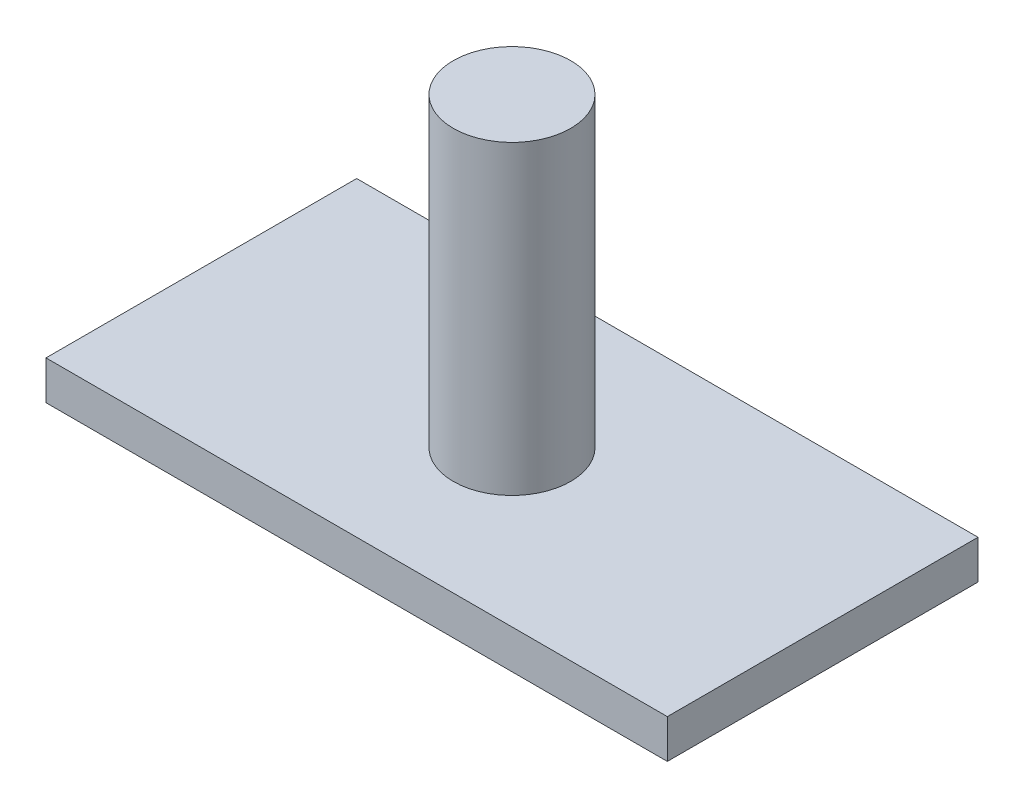
ISO-10303-21;
HEADER;
FILE_DESCRIPTION(('STEP AP214'),'2;1');
FILE_NAME('part.step','',(''),(''),'','','');
FILE_SCHEMA(('AUTOMOTIVE_DESIGN { 1 0 10303 214 1 1 1 1 }'));
ENDSEC;
DATA;
#1=APPLICATION_CONTEXT('core data for automotive mechanical design processes');
#2=APPLICATION_PROTOCOL_DEFINITION('international standard','automotive_design',2000,#1);
#3=PRODUCT_CONTEXT('',#1,'mechanical');
#4=PRODUCT('Part','Part','',(#3));
#5=PRODUCT_RELATED_PRODUCT_CATEGORY('part','',(#4));
#6=PRODUCT_DEFINITION_FORMATION('','',#4);
#7=PRODUCT_DEFINITION_CONTEXT('part definition',#1,'design');
#8=PRODUCT_DEFINITION('design','',#6,#7);
#9=PRODUCT_DEFINITION_SHAPE('','',#8);
#10=(LENGTH_UNIT() NAMED_UNIT(*) SI_UNIT(.MILLI.,.METRE.));
#11=(NAMED_UNIT(*) PLANE_ANGLE_UNIT() SI_UNIT($,.RADIAN.));
#12=(NAMED_UNIT(*) SI_UNIT($,.STERADIAN.) SOLID_ANGLE_UNIT());
#13=UNCERTAINTY_MEASURE_WITH_UNIT(LENGTH_MEASURE(1.E-05),#10,'distance_accuracy_value','');
#14=(GEOMETRIC_REPRESENTATION_CONTEXT(3) GLOBAL_UNCERTAINTY_ASSIGNED_CONTEXT((#13)) GLOBAL_UNIT_ASSIGNED_CONTEXT((#10,
#11,#12)) REPRESENTATION_CONTEXT('',''));
#15=CARTESIAN_POINT('',(0.,0.,0.));
#16=DIRECTION('',(0.,0.,1.));
#17=DIRECTION('',(1.,0.,0.));
#18=AXIS2_PLACEMENT_3D('',#15,#16,#17);
#19=CARTESIAN_POINT('',(0.,3.175,0.));
#20=DIRECTION('',(1.,0.,0.));
#21=DIRECTION('',(0.,0.,-1.));
#22=AXIS2_PLACEMENT_3D('',#19,#20,#21);
#23=PLANE('',#22);
#24=DIRECTION('',(0.,0.,1.));
#25=VECTOR('',#24,1.);
#26=CARTESIAN_POINT('',(0.,0.,0.));
#27=LINE('',#26,#25);
#28=CARTESIAN_POINT('',(0.,0.,-25.4));
#29=VERTEX_POINT('',#28);
#30=CARTESIAN_POINT('',(0.,0.,0.));
#31=VERTEX_POINT('',#30);
#32=EDGE_CURVE('E99',#29,#31,#27,.T.);
#33=ORIENTED_EDGE('',*,*,#32,.T.);
#34=DIRECTION('',(0.,-1.,0.));
#35=VECTOR('',#34,1.);
#36=CARTESIAN_POINT('',(0.,3.175,0.));
#37=LINE('',#36,#35);
#38=CARTESIAN_POINT('',(0.,3.175,0.));
#39=VERTEX_POINT('',#38);
#40=EDGE_CURVE('E36',#39,#31,#37,.T.);
#41=ORIENTED_EDGE('',*,*,#40,.F.);
#42=DIRECTION('',(0.,0.,1.));
#43=VECTOR('',#42,1.);
#44=CARTESIAN_POINT('',(0.,3.175,0.));
#45=LINE('',#44,#43);
#46=CARTESIAN_POINT('',(0.,3.175,-25.4));
#47=VERTEX_POINT('',#46);
#48=EDGE_CURVE('E86',#47,#39,#45,.T.);
#49=ORIENTED_EDGE('',*,*,#48,.F.);
#50=DIRECTION('',(0.,-1.,0.));
#51=VECTOR('',#50,1.);
#52=CARTESIAN_POINT('',(0.,3.175,-25.4));
#53=LINE('',#52,#51);
#54=EDGE_CURVE('E95',#47,#29,#53,.T.);
#55=ORIENTED_EDGE('',*,*,#54,.T.);
#56=EDGE_LOOP('',(#33,#41,#49,#55));
#57=FACE_BOUND('',#56,.T.);
#58=ADVANCED_FACE('F33',(#57),#23,.F.);
#59=CARTESIAN_POINT('',(0.,3.175,0.));
#60=DIRECTION('',(0.,0.,-1.));
#61=DIRECTION('',(-1.,0.,0.));
#62=AXIS2_PLACEMENT_3D('',#59,#60,#61);
#63=PLANE('',#62);
#64=DIRECTION('',(1.,0.,0.));
#65=VECTOR('',#64,1.);
#66=CARTESIAN_POINT('',(0.,0.,0.));
#67=LINE('',#66,#65);
#68=CARTESIAN_POINT('',(50.8,0.,0.));
#69=VERTEX_POINT('',#68);
#70=EDGE_CURVE('E91',#31,#69,#67,.T.);
#71=ORIENTED_EDGE('',*,*,#70,.T.);
#72=DIRECTION('',(0.,-1.,0.));
#73=VECTOR('',#72,1.);
#74=CARTESIAN_POINT('',(50.8,3.175,0.));
#75=LINE('',#74,#73);
#76=CARTESIAN_POINT('',(50.8,3.175,0.));
#77=VERTEX_POINT('',#76);
#78=EDGE_CURVE('E89',#77,#69,#75,.T.);
#79=ORIENTED_EDGE('',*,*,#78,.F.);
#80=DIRECTION('',(1.,0.,0.));
#81=VECTOR('',#80,1.);
#82=CARTESIAN_POINT('',(0.,3.175,0.));
#83=LINE('',#82,#81);
#84=EDGE_CURVE('E81',#39,#77,#83,.T.);
#85=ORIENTED_EDGE('',*,*,#84,.F.);
#86=ORIENTED_EDGE('',*,*,#40,.T.);
#87=EDGE_LOOP('',(#71,#79,#85,#86));
#88=FACE_BOUND('',#87,.T.);
#89=ADVANCED_FACE('F90',(#88),#63,.F.);
#90=CARTESIAN_POINT('',(50.8,3.175,0.));
#91=DIRECTION('',(-1.,0.,0.));
#92=DIRECTION('',(0.,0.,1.));
#93=AXIS2_PLACEMENT_3D('',#90,#91,#92);
#94=PLANE('',#93);
#95=DIRECTION('',(0.,0.,-1.));
#96=VECTOR('',#95,1.);
#97=CARTESIAN_POINT('',(50.8,0.,0.));
#98=LINE('',#97,#96);
#99=CARTESIAN_POINT('',(50.8,0.,-25.4));
#100=VERTEX_POINT('',#99);
#101=EDGE_CURVE('E67',#69,#100,#98,.T.);
#102=ORIENTED_EDGE('',*,*,#101,.T.);
#103=DIRECTION('',(0.,-1.,0.));
#104=VECTOR('',#103,1.);
#105=CARTESIAN_POINT('',(50.8,3.175,-25.4));
#106=LINE('',#105,#104);
#107=CARTESIAN_POINT('',(50.8,3.175,-25.4));
#108=VERTEX_POINT('',#107);
#109=EDGE_CURVE('E92',#108,#100,#106,.T.);
#110=ORIENTED_EDGE('',*,*,#109,.F.);
#111=DIRECTION('',(0.,0.,-1.));
#112=VECTOR('',#111,1.);
#113=CARTESIAN_POINT('',(50.8,3.175,0.));
#114=LINE('',#113,#112);
#115=EDGE_CURVE('E84',#77,#108,#114,.T.);
#116=ORIENTED_EDGE('',*,*,#115,.F.);
#117=ORIENTED_EDGE('',*,*,#78,.T.);
#118=EDGE_LOOP('',(#102,#110,#116,#117));
#119=FACE_BOUND('',#118,.T.);
#120=ADVANCED_FACE('F93',(#119),#94,.F.);
#121=CARTESIAN_POINT('',(0.,3.175,-25.4));
#122=DIRECTION('',(0.,0.,1.));
#123=DIRECTION('',(1.,0.,0.));
#124=AXIS2_PLACEMENT_3D('',#121,#122,#123);
#125=PLANE('',#124);
#126=DIRECTION('',(-1.,0.,0.));
#127=VECTOR('',#126,1.);
#128=CARTESIAN_POINT('',(0.,0.,-25.4));
#129=LINE('',#128,#127);
#130=EDGE_CURVE('E73',#100,#29,#129,.T.);
#131=ORIENTED_EDGE('',*,*,#130,.T.);
#132=ORIENTED_EDGE('',*,*,#54,.F.);
#133=DIRECTION('',(-1.,0.,0.));
#134=VECTOR('',#133,1.);
#135=CARTESIAN_POINT('',(0.,3.175,-25.4));
#136=LINE('',#135,#134);
#137=EDGE_CURVE('E50',#108,#47,#136,.T.);
#138=ORIENTED_EDGE('',*,*,#137,.F.);
#139=ORIENTED_EDGE('',*,*,#109,.T.);
#140=EDGE_LOOP('',(#131,#132,#138,#139));
#141=FACE_BOUND('',#140,.T.);
#142=ADVANCED_FACE('F107',(#141),#125,.F.);
#143=CARTESIAN_POINT('',(0.,3.175,0.));
#144=DIRECTION('',(0.,-1.,0.));
#145=DIRECTION('',(0.,0.,-1.));
#146=AXIS2_PLACEMENT_3D('',#143,#144,#145);
#147=PLANE('',#146);
#148=CARTESIAN_POINT('',(25.4,3.175,-12.7));
#149=DIRECTION('',(0.,1.,0.));
#150=DIRECTION('',(0.,0.,1.));
#151=AXIS2_PLACEMENT_3D('',#148,#149,#150);
#152=CIRCLE('',#151,4.8);
#153=CARTESIAN_POINT('',(25.4,3.175,-7.9));
#154=VERTEX_POINT('',#153);
#155=EDGE_CURVE('E11',#154,#154,#152,.T.);
#156=ORIENTED_EDGE('',*,*,#155,.F.);
#157=EDGE_LOOP('',(#156));
#158=FACE_BOUND('',#157,.T.);
#159=ORIENTED_EDGE('',*,*,#48,.T.);
#160=ORIENTED_EDGE('',*,*,#84,.T.);
#161=ORIENTED_EDGE('',*,*,#115,.T.);
#162=ORIENTED_EDGE('',*,*,#137,.T.);
#163=EDGE_LOOP('',(#159,#160,#161,#162));
#164=FACE_BOUND('',#163,.T.);
#165=ADVANCED_FACE('F82',(#158,#164),#147,.F.);
#166=CARTESIAN_POINT('',(0.,0.,0.));
#167=DIRECTION('',(0.,-1.,0.));
#168=DIRECTION('',(0.,0.,-1.));
#169=AXIS2_PLACEMENT_3D('',#166,#167,#168);
#170=PLANE('',#169);
#171=ORIENTED_EDGE('',*,*,#32,.F.);
#172=ORIENTED_EDGE('',*,*,#130,.F.);
#173=ORIENTED_EDGE('',*,*,#101,.F.);
#174=ORIENTED_EDGE('',*,*,#70,.F.);
#175=EDGE_LOOP('',(#171,#172,#173,#174));
#176=FACE_BOUND('',#175,.T.);
#177=ADVANCED_FACE('F110',(#176),#170,.T.);
#178=CARTESIAN_POINT('',(25.4,28.175,-12.7));
#179=DIRECTION('',(0.,-1.,0.));
#180=DIRECTION('',(0.,0.,-1.));
#181=AXIS2_PLACEMENT_3D('',#178,#179,#180);
#182=CYLINDRICAL_SURFACE('',#181,4.8);
#183=CARTESIAN_POINT('',(25.4,28.175,-12.7));
#184=DIRECTION('',(0.,1.,0.));
#185=DIRECTION('',(0.,0.,1.));
#186=AXIS2_PLACEMENT_3D('',#183,#184,#185);
#187=CIRCLE('',#186,4.8);
#188=CARTESIAN_POINT('',(25.4,28.175,-7.9));
#189=VERTEX_POINT('',#188);
#190=EDGE_CURVE('E102',#189,#189,#187,.T.);
#191=ORIENTED_EDGE('',*,*,#190,.F.);
#192=EDGE_LOOP('',(#191));
#193=FACE_BOUND('',#192,.T.);
#194=ORIENTED_EDGE('',*,*,#155,.T.);
#195=EDGE_LOOP('',(#194));
#196=FACE_BOUND('',#195,.T.);
#197=ADVANCED_FACE('F118',(#193,#196),#182,.T.);
#198=CARTESIAN_POINT('',(25.4,28.175,-12.7));
#199=DIRECTION('',(0.,1.,0.));
#200=DIRECTION('',(0.,0.,1.));
#201=AXIS2_PLACEMENT_3D('',#198,#199,#200);
#202=PLANE('',#201);
#203=ORIENTED_EDGE('',*,*,#190,.T.);
#204=EDGE_LOOP('',(#203));
#205=FACE_BOUND('',#204,.T.);
#206=ADVANCED_FACE('F116',(#205),#202,.T.);
#207=CLOSED_SHELL('',(#58,#89,#120,#142,#165,#177,#197,#206));
#208=MANIFOLD_SOLID_BREP('B2',#207);
#209=ADVANCED_BREP_SHAPE_REPRESENTATION('',(#18,#208),#14);
#210=SHAPE_DEFINITION_REPRESENTATION(#9,#209);
ENDSEC;
END-ISO-10303-21;
